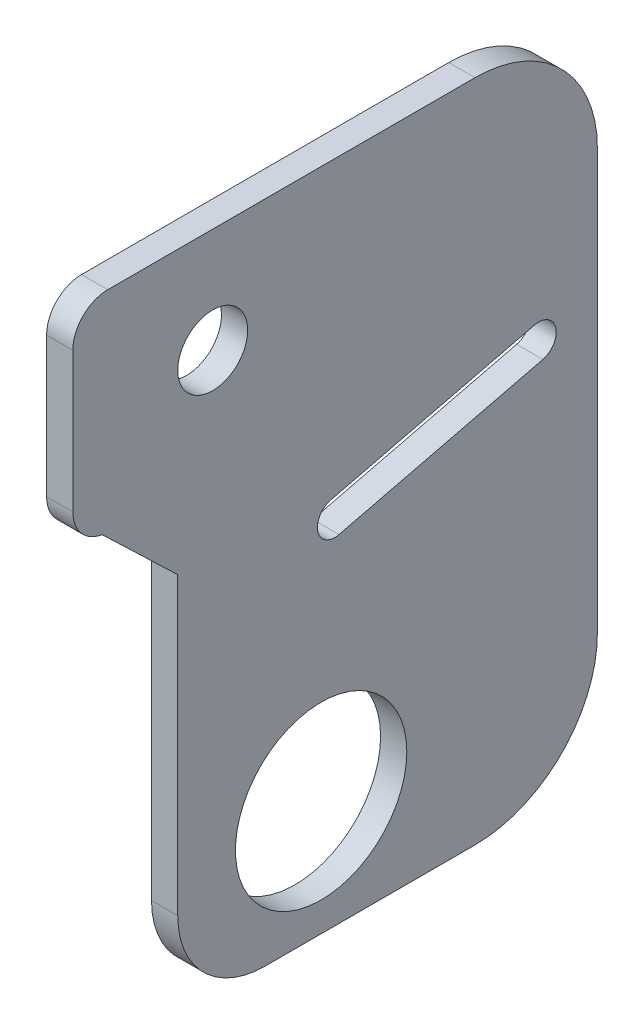
ISO-10303-21;
HEADER;
FILE_DESCRIPTION(('STEP AP214'),'2;1');
FILE_NAME('part.step','',(''),(''),'','','');
FILE_SCHEMA(('AUTOMOTIVE_DESIGN { 1 0 10303 214 1 1 1 1 }'));
ENDSEC;
DATA;
#1=APPLICATION_CONTEXT('core data for automotive mechanical design processes');
#2=APPLICATION_PROTOCOL_DEFINITION('international standard','automotive_design',2000,#1);
#3=PRODUCT_CONTEXT('',#1,'mechanical');
#4=PRODUCT('Part','Part','',(#3));
#5=PRODUCT_RELATED_PRODUCT_CATEGORY('part','',(#4));
#6=PRODUCT_DEFINITION_FORMATION('','',#4);
#7=PRODUCT_DEFINITION_CONTEXT('part definition',#1,'design');
#8=PRODUCT_DEFINITION('design','',#6,#7);
#9=PRODUCT_DEFINITION_SHAPE('','',#8);
#10=(LENGTH_UNIT() NAMED_UNIT(*) SI_UNIT(.MILLI.,.METRE.));
#11=(NAMED_UNIT(*) PLANE_ANGLE_UNIT() SI_UNIT($,.RADIAN.));
#12=(NAMED_UNIT(*) SI_UNIT($,.STERADIAN.) SOLID_ANGLE_UNIT());
#13=UNCERTAINTY_MEASURE_WITH_UNIT(LENGTH_MEASURE(1.E-05),#10,'distance_accuracy_value','');
#14=(GEOMETRIC_REPRESENTATION_CONTEXT(3) GLOBAL_UNCERTAINTY_ASSIGNED_CONTEXT((#13)) GLOBAL_UNIT_ASSIGNED_CONTEXT((#10,
#11,#12)) REPRESENTATION_CONTEXT('',''));
#15=CARTESIAN_POINT('',(0.,0.,0.));
#16=DIRECTION('',(0.,0.,1.));
#17=DIRECTION('',(1.,0.,0.));
#18=AXIS2_PLACEMENT_3D('',#15,#16,#17);
#19=CARTESIAN_POINT('',(7.5,60.,190.));
#20=DIRECTION('',(0.,-1.,0.));
#21=DIRECTION('',(0.,0.,-1.));
#22=AXIS2_PLACEMENT_3D('',#19,#20,#21);
#23=PLANE('',#22);
#24=DIRECTION('',(0.,0.,1.));
#25=VECTOR('',#24,1.);
#26=CARTESIAN_POINT('',(7.5,60.,190.));
#27=LINE('',#26,#25);
#28=CARTESIAN_POINT('',(7.5,60.,-40.));
#29=VERTEX_POINT('',#28);
#30=CARTESIAN_POINT('',(7.5,60.,170.));
#31=VERTEX_POINT('',#30);
#32=EDGE_CURVE('E200',#29,#31,#27,.T.);
#33=ORIENTED_EDGE('',*,*,#32,.F.);
#34=DIRECTION('',(1.,0.,0.));
#35=VECTOR('',#34,1.);
#36=CARTESIAN_POINT('',(7.5,60.,-40.));
#37=LINE('',#36,#35);
#38=CARTESIAN_POINT('',(-7.5,60.,-40.));
#39=VERTEX_POINT('',#38);
#40=EDGE_CURVE('E261',#29,#39,#37,.F.);
#41=ORIENTED_EDGE('',*,*,#40,.T.);
#42=DIRECTION('',(0.,0.,1.));
#43=VECTOR('',#42,1.);
#44=CARTESIAN_POINT('',(-7.5,60.,190.));
#45=LINE('',#44,#43);
#46=CARTESIAN_POINT('',(-7.5,60.,170.));
#47=VERTEX_POINT('',#46);
#48=EDGE_CURVE('E196',#39,#47,#45,.T.);
#49=ORIENTED_EDGE('',*,*,#48,.T.);
#50=DIRECTION('',(-1.,0.,0.));
#51=VECTOR('',#50,1.);
#52=CARTESIAN_POINT('',(7.5,60.,170.));
#53=LINE('',#52,#51);
#54=EDGE_CURVE('E230',#47,#31,#53,.F.);
#55=ORIENTED_EDGE('',*,*,#54,.T.);
#56=EDGE_LOOP('',(#33,#41,#49,#55));
#57=FACE_BOUND('',#56,.T.);
#58=ADVANCED_FACE('F17',(#57),#23,.F.);
#59=CARTESIAN_POINT('',(7.5,60.,190.));
#60=DIRECTION('',(0.,0.,-1.));
#61=DIRECTION('',(0.,1.,0.));
#62=AXIS2_PLACEMENT_3D('',#59,#60,#61);
#63=PLANE('',#62);
#64=DIRECTION('',(0.,-1.,0.));
#65=VECTOR('',#64,1.);
#66=CARTESIAN_POINT('',(-7.5,60.,190.));
#67=LINE('',#66,#65);
#68=CARTESIAN_POINT('',(-7.5,40.,190.));
#69=VERTEX_POINT('',#68);
#70=CARTESIAN_POINT('',(-7.5,-40.,190.));
#71=VERTEX_POINT('',#70);
#72=EDGE_CURVE('E204',#69,#71,#67,.T.);
#73=ORIENTED_EDGE('',*,*,#72,.T.);
#74=DIRECTION('',(-1.,0.,0.));
#75=VECTOR('',#74,1.);
#76=CARTESIAN_POINT('',(7.5,-40.,190.));
#77=LINE('',#76,#75);
#78=CARTESIAN_POINT('',(7.5,-40.,190.));
#79=VERTEX_POINT('',#78);
#80=EDGE_CURVE('E222',#71,#79,#77,.F.);
#81=ORIENTED_EDGE('',*,*,#80,.T.);
#82=DIRECTION('',(0.,-1.,0.));
#83=VECTOR('',#82,1.);
#84=CARTESIAN_POINT('',(7.5,60.,190.));
#85=LINE('',#84,#83);
#86=CARTESIAN_POINT('',(7.5,40.,190.));
#87=VERTEX_POINT('',#86);
#88=EDGE_CURVE('E203',#87,#79,#85,.T.);
#89=ORIENTED_EDGE('',*,*,#88,.F.);
#90=DIRECTION('',(-1.,0.,0.));
#91=VECTOR('',#90,1.);
#92=CARTESIAN_POINT('',(7.5,40.,190.));
#93=LINE('',#92,#91);
#94=EDGE_CURVE('E219',#87,#69,#93,.T.);
#95=ORIENTED_EDGE('',*,*,#94,.T.);
#96=EDGE_LOOP('',(#73,#81,#89,#95));
#97=FACE_BOUND('',#96,.T.);
#98=ADVANCED_FACE('F288',(#97),#63,.F.);
#99=CARTESIAN_POINT('',(7.5,0.,0.));
#100=DIRECTION('',(1.,0.,0.));
#101=DIRECTION('',(0.,0.,-1.));
#102=AXIS2_PLACEMENT_3D('',#99,#100,#101);
#103=PLANE('',#102);
#104=DIRECTION('',(0.,-1.,0.));
#105=VECTOR('',#104,1.);
#106=CARTESIAN_POINT('',(7.5,-320.,130.));
#107=LINE('',#106,#105);
#108=CARTESIAN_POINT('',(7.5,-101.142618033245,130.));
#109=VERTEX_POINT('',#108);
#110=CARTESIAN_POINT('',(7.5,-270.,130.));
#111=VERTEX_POINT('',#110);
#112=EDGE_CURVE('E183',#109,#111,#107,.T.);
#113=ORIENTED_EDGE('',*,*,#112,.T.);
#114=CARTESIAN_POINT('',(7.5,-270.,80.));
#115=DIRECTION('',(1.,0.,0.));
#116=DIRECTION('',(0.,0.,-1.));
#117=AXIS2_PLACEMENT_3D('',#114,#115,#116);
#118=CIRCLE('',#117,50.);
#119=CARTESIAN_POINT('',(7.5,-320.,80.));
#120=VERTEX_POINT('',#119);
#121=EDGE_CURVE('E39',#111,#120,#118,.T.);
#122=ORIENTED_EDGE('',*,*,#121,.T.);
#123=DIRECTION('',(0.,0.,-1.));
#124=VECTOR('',#123,1.);
#125=CARTESIAN_POINT('',(7.5,-320.,-190.));
#126=LINE('',#125,#124);
#127=CARTESIAN_POINT('',(7.5,-320.,-40.));
#128=VERTEX_POINT('',#127);
#129=EDGE_CURVE('E187',#120,#128,#126,.T.);
#130=ORIENTED_EDGE('',*,*,#129,.T.);
#131=CARTESIAN_POINT('',(7.5,-250.,-40.));
#132=DIRECTION('',(1.,0.,0.));
#133=DIRECTION('',(0.,0.,-1.));
#134=AXIS2_PLACEMENT_3D('',#131,#132,#133);
#135=CIRCLE('',#134,70.);
#136=CARTESIAN_POINT('',(7.5,-250.,-110.));
#137=VERTEX_POINT('',#136);
#138=EDGE_CURVE('E250',#128,#137,#135,.T.);
#139=ORIENTED_EDGE('',*,*,#138,.T.);
#140=DIRECTION('',(0.,-1.,0.));
#141=VECTOR('',#140,1.);
#142=CARTESIAN_POINT('',(7.5,60.,-110.));
#143=LINE('',#142,#141);
#144=CARTESIAN_POINT('',(7.5,-10.,-110.));
#145=VERTEX_POINT('',#144);
#146=EDGE_CURVE('E308',#145,#137,#143,.T.);
#147=ORIENTED_EDGE('',*,*,#146,.F.);
#148=CARTESIAN_POINT('',(7.5,-10.,-40.));
#149=DIRECTION('',(1.,0.,0.));
#150=DIRECTION('',(0.,0.,-1.));
#151=AXIS2_PLACEMENT_3D('',#148,#149,#150);
#152=CIRCLE('',#151,70.);
#153=EDGE_CURVE('E248',#145,#29,#152,.T.);
#154=ORIENTED_EDGE('',*,*,#153,.T.);
#155=ORIENTED_EDGE('',*,*,#32,.T.);
#156=CARTESIAN_POINT('',(7.5,40.,170.));
#157=DIRECTION('',(1.,0.,0.));
#158=DIRECTION('',(0.,0.,-1.));
#159=AXIS2_PLACEMENT_3D('',#156,#157,#158);
#160=CIRCLE('',#159,20.);
#161=EDGE_CURVE('E224',#31,#87,#160,.T.);
#162=ORIENTED_EDGE('',*,*,#161,.T.);
#163=ORIENTED_EDGE('',*,*,#88,.T.);
#164=CARTESIAN_POINT('',(7.5,-40.,170.));
#165=DIRECTION('',(1.,0.,0.));
#166=DIRECTION('',(0.,0.,-1.));
#167=AXIS2_PLACEMENT_3D('',#164,#165,#166);
#168=CIRCLE('',#167,20.);
#169=CARTESIAN_POINT('',(7.5,-59.7377568340172,173.228150424191));
#170=VERTEX_POINT('',#169);
#171=EDGE_CURVE('E227',#79,#170,#168,.T.);
#172=ORIENTED_EDGE('',*,*,#171,.T.);
#173=DIRECTION('',(0.,0.691712742762419,0.722172750455243));
#174=VECTOR('',#173,1.);
#175=CARTESIAN_POINT('',(7.5,-59.7377568340172,173.228150424191));
#176=LINE('',#175,#174);
#177=EDGE_CURVE('E240',#170,#109,#176,.F.);
#178=ORIENTED_EDGE('',*,*,#177,.T.);
#179=EDGE_LOOP('',(#113,#122,#130,#139,#147,#154,#155,#162,#163,#172,#178));
#180=FACE_BOUND('',#179,.T.);
#181=CARTESIAN_POINT('',(7.5,-117.661235254384,40.1385534607934));
#182=DIRECTION('',(1.,0.,0.));
#183=DIRECTION('',(0.,0.,-1.));
#184=AXIS2_PLACEMENT_3D('',#181,#182,#183);
#185=CIRCLE('',#184,10.);
#186=CARTESIAN_POINT('',(7.5,-107.945873619582,42.507466355989));
#187=VERTEX_POINT('',#186);
#188=CARTESIAN_POINT('',(7.5,-127.376596889186,37.7696405655978));
#189=VERTEX_POINT('',#188);
#190=EDGE_CURVE('E130',#187,#189,#185,.T.);
#191=ORIENTED_EDGE('',*,*,#190,.F.);
#192=DIRECTION('',(0.,-0.236891289519562,0.971536163480166));
#193=VECTOR('',#192,1.);
#194=CARTESIAN_POINT('',(7.5,-107.945873619582,42.507466355989));
#195=LINE('',#194,#193);
#196=CARTESIAN_POINT('',(7.5,-79.518918877235,-74.0768732616309));
#197=VERTEX_POINT('',#196);
#198=EDGE_CURVE('E136',#197,#187,#195,.T.);
#199=ORIENTED_EDGE('',*,*,#198,.F.);
#200=CARTESIAN_POINT('',(7.5,-89.2342805120367,-76.4457861568265));
#201=DIRECTION('',(1.,0.,0.));
#202=DIRECTION('',(0.,0.,-1.));
#203=AXIS2_PLACEMENT_3D('',#200,#201,#202);
#204=CIRCLE('',#203,10.);
#205=CARTESIAN_POINT('',(7.5,-98.9496421468384,-78.8146990520221));
#206=VERTEX_POINT('',#205);
#207=EDGE_CURVE('E167',#206,#197,#204,.T.);
#208=ORIENTED_EDGE('',*,*,#207,.F.);
#209=DIRECTION('',(0.,0.236891289519562,-0.971536163480166));
#210=VECTOR('',#209,1.);
#211=CARTESIAN_POINT('',(7.5,-127.376596889186,37.7696405655977));
#212=LINE('',#211,#210);
#213=EDGE_CURVE('E158',#189,#206,#212,.T.);
#214=ORIENTED_EDGE('',*,*,#213,.F.);
#215=EDGE_LOOP('',(#191,#199,#208,#214));
#216=FACE_BOUND('',#215,.T.);
#217=CARTESIAN_POINT('',(7.5,-254.273773670333,48.));
#218=DIRECTION('',(1.,0.,0.));
#219=DIRECTION('',(0.,0.,-1.));
#220=AXIS2_PLACEMENT_3D('',#217,#218,#219);
#221=CIRCLE('',#220,49.);
#222=CARTESIAN_POINT('',(7.5,-254.273773670333,-1.));
#223=VERTEX_POINT('',#222);
#224=EDGE_CURVE('E144',#223,#223,#221,.T.);
#225=ORIENTED_EDGE('',*,*,#224,.F.);
#226=EDGE_LOOP('',(#225));
#227=FACE_BOUND('',#226,.T.);
#228=CARTESIAN_POINT('',(7.5,0.,110.));
#229=DIRECTION('',(1.,0.,0.));
#230=DIRECTION('',(0.,0.,-1.));
#231=AXIS2_PLACEMENT_3D('',#228,#229,#230);
#232=CIRCLE('',#231,20.);
#233=CARTESIAN_POINT('',(7.5,0.,90.));
#234=VERTEX_POINT('',#233);
#235=EDGE_CURVE('E191',#234,#234,#232,.T.);
#236=ORIENTED_EDGE('',*,*,#235,.F.);
#237=EDGE_LOOP('',(#236));
#238=FACE_BOUND('',#237,.T.);
#239=ADVANCED_FACE('F274',(#180,#216,#227,#238),#103,.T.);
#240=CARTESIAN_POINT('',(-7.5,0.,0.));
#241=DIRECTION('',(1.,0.,0.));
#242=DIRECTION('',(0.,0.,-1.));
#243=AXIS2_PLACEMENT_3D('',#240,#241,#242);
#244=PLANE('',#243);
#245=DIRECTION('',(0.,0.236891289519562,-0.971536163480166));
#246=VECTOR('',#245,1.);
#247=CARTESIAN_POINT('',(-7.5,-107.945873619582,42.507466355989));
#248=LINE('',#247,#246);
#249=CARTESIAN_POINT('',(-7.5,-107.945873619582,42.507466355989));
#250=VERTEX_POINT('',#249);
#251=CARTESIAN_POINT('',(-7.5,-79.518918877235,-74.0768732616309));
#252=VERTEX_POINT('',#251);
#253=EDGE_CURVE('E150',#250,#252,#248,.T.);
#254=ORIENTED_EDGE('',*,*,#253,.F.);
#255=CARTESIAN_POINT('',(-7.5,-117.661235254384,40.1385534607934));
#256=DIRECTION('',(1.,0.,0.));
#257=DIRECTION('',(0.,0.,-1.));
#258=AXIS2_PLACEMENT_3D('',#255,#256,#257);
#259=CIRCLE('',#258,10.);
#260=CARTESIAN_POINT('',(-7.5,-127.376596889186,37.7696405655977));
#261=VERTEX_POINT('',#260);
#262=EDGE_CURVE('E127',#261,#250,#259,.F.);
#263=ORIENTED_EDGE('',*,*,#262,.F.);
#264=DIRECTION('',(0.,-0.236891289519562,0.971536163480166));
#265=VECTOR('',#264,1.);
#266=CARTESIAN_POINT('',(-7.5,-127.376596889186,37.7696405655977));
#267=LINE('',#266,#265);
#268=CARTESIAN_POINT('',(-7.5,-98.9496421468384,-78.8146990520221));
#269=VERTEX_POINT('',#268);
#270=EDGE_CURVE('E140',#269,#261,#267,.T.);
#271=ORIENTED_EDGE('',*,*,#270,.F.);
#272=CARTESIAN_POINT('',(-7.5,-89.2342805120367,-76.4457861568265));
#273=DIRECTION('',(1.,0.,0.));
#274=DIRECTION('',(0.,0.,-1.));
#275=AXIS2_PLACEMENT_3D('',#272,#273,#274);
#276=CIRCLE('',#275,10.);
#277=EDGE_CURVE('E161',#252,#269,#276,.F.);
#278=ORIENTED_EDGE('',*,*,#277,.F.);
#279=EDGE_LOOP('',(#254,#263,#271,#278));
#280=FACE_BOUND('',#279,.T.);
#281=CARTESIAN_POINT('',(-7.5,-254.273773670333,48.));
#282=DIRECTION('',(1.,0.,0.));
#283=DIRECTION('',(0.,0.,-1.));
#284=AXIS2_PLACEMENT_3D('',#281,#282,#283);
#285=CIRCLE('',#284,49.);
#286=CARTESIAN_POINT('',(-7.5,-254.273773670333,-1.));
#287=VERTEX_POINT('',#286);
#288=EDGE_CURVE('E180',#287,#287,#285,.F.);
#289=ORIENTED_EDGE('',*,*,#288,.F.);
#290=EDGE_LOOP('',(#289));
#291=FACE_BOUND('',#290,.T.);
#292=CARTESIAN_POINT('',(-7.5,0.,110.));
#293=DIRECTION('',(1.,0.,0.));
#294=DIRECTION('',(0.,0.,-1.));
#295=AXIS2_PLACEMENT_3D('',#292,#293,#294);
#296=CIRCLE('',#295,20.);
#297=CARTESIAN_POINT('',(-7.5,0.,90.));
#298=VERTEX_POINT('',#297);
#299=EDGE_CURVE('E192',#298,#298,#296,.T.);
#300=ORIENTED_EDGE('',*,*,#299,.T.);
#301=EDGE_LOOP('',(#300));
#302=FACE_BOUND('',#301,.T.);
#303=DIRECTION('',(0.,0.,1.));
#304=VECTOR('',#303,1.);
#305=CARTESIAN_POINT('',(-7.5,-320.,-190.));
#306=LINE('',#305,#304);
#307=CARTESIAN_POINT('',(-7.5,-320.,-40.));
#308=VERTEX_POINT('',#307);
#309=CARTESIAN_POINT('',(-7.5,-320.,80.));
#310=VERTEX_POINT('',#309);
#311=EDGE_CURVE('E186',#308,#310,#306,.T.);
#312=ORIENTED_EDGE('',*,*,#311,.T.);
#313=CARTESIAN_POINT('',(-7.5,-270.,80.));
#314=DIRECTION('',(1.,0.,0.));
#315=DIRECTION('',(0.,0.,-1.));
#316=AXIS2_PLACEMENT_3D('',#313,#314,#315);
#317=CIRCLE('',#316,50.);
#318=CARTESIAN_POINT('',(-7.5,-270.,130.));
#319=VERTEX_POINT('',#318);
#320=EDGE_CURVE('E11',#310,#319,#317,.F.);
#321=ORIENTED_EDGE('',*,*,#320,.T.);
#322=DIRECTION('',(0.,1.,0.));
#323=VECTOR('',#322,1.);
#324=CARTESIAN_POINT('',(-7.5,-320.,130.));
#325=LINE('',#324,#323);
#326=CARTESIAN_POINT('',(-7.5,-101.142618033245,130.));
#327=VERTEX_POINT('',#326);
#328=EDGE_CURVE('E184',#319,#327,#325,.T.);
#329=ORIENTED_EDGE('',*,*,#328,.T.);
#330=DIRECTION('',(0.,-0.691712742762419,-0.722172750455243));
#331=VECTOR('',#330,1.);
#332=CARTESIAN_POINT('',(-7.5,-117.68895392645,112.725035750778));
#333=LINE('',#332,#331);
#334=CARTESIAN_POINT('',(-7.5,-59.7377568340172,173.228150424191));
#335=VERTEX_POINT('',#334);
#336=EDGE_CURVE('E242',#327,#335,#333,.F.);
#337=ORIENTED_EDGE('',*,*,#336,.T.);
#338=CARTESIAN_POINT('',(-7.5,-40.,170.));
#339=DIRECTION('',(1.,0.,0.));
#340=DIRECTION('',(0.,0.,-1.));
#341=AXIS2_PLACEMENT_3D('',#338,#339,#340);
#342=CIRCLE('',#341,20.);
#343=EDGE_CURVE('E217',#335,#71,#342,.F.);
#344=ORIENTED_EDGE('',*,*,#343,.T.);
#345=ORIENTED_EDGE('',*,*,#72,.F.);
#346=CARTESIAN_POINT('',(-7.5,40.,170.));
#347=DIRECTION('',(1.,0.,0.));
#348=DIRECTION('',(0.,0.,-1.));
#349=AXIS2_PLACEMENT_3D('',#346,#347,#348);
#350=CIRCLE('',#349,20.);
#351=EDGE_CURVE('E208',#69,#47,#350,.F.);
#352=ORIENTED_EDGE('',*,*,#351,.T.);
#353=ORIENTED_EDGE('',*,*,#48,.F.);
#354=CARTESIAN_POINT('',(-7.5,-10.,-40.));
#355=DIRECTION('',(1.,0.,0.));
#356=DIRECTION('',(0.,0.,-1.));
#357=AXIS2_PLACEMENT_3D('',#354,#355,#356);
#358=CIRCLE('',#357,70.);
#359=CARTESIAN_POINT('',(-7.5,-10.,-110.));
#360=VERTEX_POINT('',#359);
#361=EDGE_CURVE('E257',#39,#360,#358,.F.);
#362=ORIENTED_EDGE('',*,*,#361,.T.);
#363=DIRECTION('',(0.,1.,0.));
#364=VECTOR('',#363,1.);
#365=CARTESIAN_POINT('',(-7.5,60.,-110.));
#366=LINE('',#365,#364);
#367=CARTESIAN_POINT('',(-7.5,-250.,-110.));
#368=VERTEX_POINT('',#367);
#369=EDGE_CURVE('E310',#368,#360,#366,.T.);
#370=ORIENTED_EDGE('',*,*,#369,.F.);
#371=CARTESIAN_POINT('',(-7.5,-250.,-40.));
#372=DIRECTION('',(1.,0.,0.));
#373=DIRECTION('',(0.,0.,-1.));
#374=AXIS2_PLACEMENT_3D('',#371,#372,#373);
#375=CIRCLE('',#374,70.);
#376=EDGE_CURVE('E259',#368,#308,#375,.F.);
#377=ORIENTED_EDGE('',*,*,#376,.T.);
#378=EDGE_LOOP('',(#312,#321,#329,#337,#344,#345,#352,#353,#362,#370,#377));
#379=FACE_BOUND('',#378,.T.);
#380=ADVANCED_FACE('F147',(#280,#291,#302,#379),#244,.F.);
#381=CARTESIAN_POINT('',(-7.5,0.,110.));
#382=DIRECTION('',(1.,0.,0.));
#383=DIRECTION('',(0.,0.,-1.));
#384=AXIS2_PLACEMENT_3D('',#381,#382,#383);
#385=CYLINDRICAL_SURFACE('',#384,20.);
#386=ORIENTED_EDGE('',*,*,#299,.F.);
#387=EDGE_LOOP('',(#386));
#388=FACE_BOUND('',#387,.T.);
#389=ORIENTED_EDGE('',*,*,#235,.T.);
#390=EDGE_LOOP('',(#389));
#391=FACE_BOUND('',#390,.T.);
#392=ADVANCED_FACE('F332',(#388,#391),#385,.F.);
#393=CARTESIAN_POINT('',(7.5,-40.,170.));
#394=DIRECTION('',(-1.,0.,0.));
#395=DIRECTION('',(0.,0.,1.));
#396=AXIS2_PLACEMENT_3D('',#393,#394,#395);
#397=CYLINDRICAL_SURFACE('',#396,20.);
#398=ORIENTED_EDGE('',*,*,#343,.F.);
#399=DIRECTION('',(-1.,0.,0.));
#400=VECTOR('',#399,1.);
#401=CARTESIAN_POINT('',(7.5,-59.7377568340172,173.228150424191));
#402=LINE('',#401,#400);
#403=EDGE_CURVE('E234',#335,#170,#402,.F.);
#404=ORIENTED_EDGE('',*,*,#403,.T.);
#405=ORIENTED_EDGE('',*,*,#171,.F.);
#406=ORIENTED_EDGE('',*,*,#80,.F.);
#407=EDGE_LOOP('',(#398,#404,#405,#406));
#408=FACE_BOUND('',#407,.T.);
#409=ADVANCED_FACE('F283',(#408),#397,.T.);
#410=CARTESIAN_POINT('',(7.5,40.,170.));
#411=DIRECTION('',(-1.,0.,0.));
#412=DIRECTION('',(0.,0.,1.));
#413=AXIS2_PLACEMENT_3D('',#410,#411,#412);
#414=CYLINDRICAL_SURFACE('',#413,20.);
#415=ORIENTED_EDGE('',*,*,#161,.F.);
#416=ORIENTED_EDGE('',*,*,#54,.F.);
#417=ORIENTED_EDGE('',*,*,#351,.F.);
#418=ORIENTED_EDGE('',*,*,#94,.F.);
#419=EDGE_LOOP('',(#415,#416,#417,#418));
#420=FACE_BOUND('',#419,.T.);
#421=ADVANCED_FACE('F293',(#420),#414,.T.);
#422=CARTESIAN_POINT('',(-419.810562561766,-320.,130.));
#423=DIRECTION('',(0.,0.,1.));
#424=DIRECTION('',(1.,0.,0.));
#425=AXIS2_PLACEMENT_3D('',#422,#423,#424);
#426=PLANE('',#425);
#427=ORIENTED_EDGE('',*,*,#328,.F.);
#428=DIRECTION('',(1.,0.,0.));
#429=VECTOR('',#428,1.);
#430=CARTESIAN_POINT('',(-419.810562561766,-270.,130.));
#431=LINE('',#430,#429);
#432=EDGE_CURVE('E263',#319,#111,#431,.T.);
#433=ORIENTED_EDGE('',*,*,#432,.T.);
#434=ORIENTED_EDGE('',*,*,#112,.F.);
#435=DIRECTION('',(-1.,0.,0.));
#436=VECTOR('',#435,1.);
#437=CARTESIAN_POINT('',(-7.5,-101.142618033245,130.));
#438=LINE('',#437,#436);
#439=EDGE_CURVE('E237',#109,#327,#438,.T.);
#440=ORIENTED_EDGE('',*,*,#439,.T.);
#441=EDGE_LOOP('',(#427,#433,#434,#440));
#442=FACE_BOUND('',#441,.T.);
#443=ADVANCED_FACE('F270',(#442),#426,.T.);
#444=CARTESIAN_POINT('',(-419.810562561766,-320.,-190.));
#445=DIRECTION('',(0.,-1.,0.));
#446=DIRECTION('',(0.,0.,-1.));
#447=AXIS2_PLACEMENT_3D('',#444,#445,#446);
#448=PLANE('',#447);
#449=ORIENTED_EDGE('',*,*,#129,.F.);
#450=DIRECTION('',(1.,0.,0.));
#451=VECTOR('',#450,1.);
#452=CARTESIAN_POINT('',(-419.810562561766,-320.,80.));
#453=LINE('',#452,#451);
#454=EDGE_CURVE('E25',#120,#310,#453,.F.);
#455=ORIENTED_EDGE('',*,*,#454,.T.);
#456=ORIENTED_EDGE('',*,*,#311,.F.);
#457=DIRECTION('',(1.,0.,0.));
#458=VECTOR('',#457,1.);
#459=CARTESIAN_POINT('',(7.5,-320.,-40.));
#460=LINE('',#459,#458);
#461=EDGE_CURVE('E245',#308,#128,#460,.T.);
#462=ORIENTED_EDGE('',*,*,#461,.T.);
#463=EDGE_LOOP('',(#449,#455,#456,#462));
#464=FACE_BOUND('',#463,.T.);
#465=ADVANCED_FACE('F359',(#464),#448,.T.);
#466=CARTESIAN_POINT('',(7.5,-59.7377568340172,173.228150424191));
#467=DIRECTION('',(0.,-0.722172750455243,0.691712742762419));
#468=DIRECTION('',(-1.,0.,0.));
#469=AXIS2_PLACEMENT_3D('',#466,#467,#468);
#470=PLANE('',#469);
#471=ORIENTED_EDGE('',*,*,#336,.F.);
#472=ORIENTED_EDGE('',*,*,#439,.F.);
#473=ORIENTED_EDGE('',*,*,#177,.F.);
#474=ORIENTED_EDGE('',*,*,#403,.F.);
#475=EDGE_LOOP('',(#471,#472,#473,#474));
#476=FACE_BOUND('',#475,.T.);
#477=ADVANCED_FACE('F280',(#476),#470,.T.);
#478=CARTESIAN_POINT('',(-7.50100000000012,-254.273773670333,48.));
#479=DIRECTION('',(1.,0.,0.));
#480=DIRECTION('',(0.,0.,-1.));
#481=AXIS2_PLACEMENT_3D('',#478,#479,#480);
#482=CYLINDRICAL_SURFACE('',#481,49.);
#483=ORIENTED_EDGE('',*,*,#224,.T.);
#484=EDGE_LOOP('',(#483));
#485=FACE_BOUND('',#484,.T.);
#486=ORIENTED_EDGE('',*,*,#288,.T.);
#487=EDGE_LOOP('',(#486));
#488=FACE_BOUND('',#487,.T.);
#489=ADVANCED_FACE('F358',(#485,#488),#482,.F.);
#490=CARTESIAN_POINT('',(-7.50100000000012,-117.661235254384,40.1385534607934));
#491=DIRECTION('',(1.,0.,0.));
#492=DIRECTION('',(0.,0.,-1.));
#493=AXIS2_PLACEMENT_3D('',#490,#491,#492);
#494=CYLINDRICAL_SURFACE('',#493,10.);
#495=ORIENTED_EDGE('',*,*,#262,.T.);
#496=DIRECTION('',(1.,0.,0.));
#497=VECTOR('',#496,1.);
#498=CARTESIAN_POINT('',(-7.50100000000012,-107.945873619582,42.507466355989));
#499=LINE('',#498,#497);
#500=EDGE_CURVE('E145',#250,#187,#499,.T.);
#501=ORIENTED_EDGE('',*,*,#500,.T.);
#502=ORIENTED_EDGE('',*,*,#190,.T.);
#503=DIRECTION('',(1.,0.,0.));
#504=VECTOR('',#503,1.);
#505=CARTESIAN_POINT('',(-7.50100000000012,-127.376596889186,37.7696405655977));
#506=LINE('',#505,#504);
#507=EDGE_CURVE('E123',#261,#189,#506,.T.);
#508=ORIENTED_EDGE('',*,*,#507,.F.);
#509=EDGE_LOOP('',(#495,#501,#502,#508));
#510=FACE_BOUND('',#509,.T.);
#511=ADVANCED_FACE('F125',(#510),#494,.F.);
#512=CARTESIAN_POINT('',(-7.50100000000012,-107.945873619582,42.507466355989));
#513=DIRECTION('',(0.,0.971536163480166,0.236891289519562));
#514=DIRECTION('',(0.,-0.236891289519562,0.971536163480166));
#515=AXIS2_PLACEMENT_3D('',#512,#513,#514);
#516=PLANE('',#515);
#517=ORIENTED_EDGE('',*,*,#253,.T.);
#518=DIRECTION('',(1.,0.,0.));
#519=VECTOR('',#518,1.);
#520=CARTESIAN_POINT('',(-7.50100000000012,-79.518918877235,-74.0768732616309));
#521=LINE('',#520,#519);
#522=EDGE_CURVE('E174',#252,#197,#521,.T.);
#523=ORIENTED_EDGE('',*,*,#522,.T.);
#524=ORIENTED_EDGE('',*,*,#198,.T.);
#525=ORIENTED_EDGE('',*,*,#500,.F.);
#526=EDGE_LOOP('',(#517,#523,#524,#525));
#527=FACE_BOUND('',#526,.T.);
#528=ADVANCED_FACE('F324',(#527),#516,.F.);
#529=CARTESIAN_POINT('',(-7.50100000000012,-89.2342805120367,-76.4457861568265));
#530=DIRECTION('',(1.,0.,0.));
#531=DIRECTION('',(0.,0.,-1.));
#532=AXIS2_PLACEMENT_3D('',#529,#530,#531);
#533=CYLINDRICAL_SURFACE('',#532,10.);
#534=ORIENTED_EDGE('',*,*,#277,.T.);
#535=DIRECTION('',(1.,0.,0.));
#536=VECTOR('',#535,1.);
#537=CARTESIAN_POINT('',(-7.50100000000012,-98.9496421468384,-78.8146990520221));
#538=LINE('',#537,#536);
#539=EDGE_CURVE('E135',#269,#206,#538,.T.);
#540=ORIENTED_EDGE('',*,*,#539,.T.);
#541=ORIENTED_EDGE('',*,*,#207,.T.);
#542=ORIENTED_EDGE('',*,*,#522,.F.);
#543=EDGE_LOOP('',(#534,#540,#541,#542));
#544=FACE_BOUND('',#543,.T.);
#545=ADVANCED_FACE('F320',(#544),#533,.F.);
#546=CARTESIAN_POINT('',(-7.50100000000012,-127.376596889186,37.7696405655977));
#547=DIRECTION('',(0.,-0.971536163480166,-0.236891289519562));
#548=DIRECTION('',(0.,0.236891289519562,-0.971536163480166));
#549=AXIS2_PLACEMENT_3D('',#546,#547,#548);
#550=PLANE('',#549);
#551=ORIENTED_EDGE('',*,*,#270,.T.);
#552=ORIENTED_EDGE('',*,*,#507,.T.);
#553=ORIENTED_EDGE('',*,*,#213,.T.);
#554=ORIENTED_EDGE('',*,*,#539,.F.);
#555=EDGE_LOOP('',(#551,#552,#553,#554));
#556=FACE_BOUND('',#555,.T.);
#557=ADVANCED_FACE('F141',(#556),#550,.F.);
#558=CARTESIAN_POINT('',(-7.50100000000012,60.,-110.));
#559=DIRECTION('',(0.,0.,1.));
#560=DIRECTION('',(0.,-1.,0.));
#561=AXIS2_PLACEMENT_3D('',#558,#559,#560);
#562=PLANE('',#561);
#563=ORIENTED_EDGE('',*,*,#146,.T.);
#564=DIRECTION('',(1.,0.,0.));
#565=VECTOR('',#564,1.);
#566=CARTESIAN_POINT('',(-7.50000000000012,-250.,-110.));
#567=LINE('',#566,#565);
#568=EDGE_CURVE('E255',#137,#368,#567,.F.);
#569=ORIENTED_EDGE('',*,*,#568,.T.);
#570=ORIENTED_EDGE('',*,*,#369,.T.);
#571=DIRECTION('',(1.,0.,0.));
#572=VECTOR('',#571,1.);
#573=CARTESIAN_POINT('',(-7.50100000000012,-10.,-110.));
#574=LINE('',#573,#572);
#575=EDGE_CURVE('E252',#360,#145,#574,.T.);
#576=ORIENTED_EDGE('',*,*,#575,.T.);
#577=EDGE_LOOP('',(#563,#569,#570,#576));
#578=FACE_BOUND('',#577,.T.);
#579=ADVANCED_FACE('F307',(#578),#562,.F.);
#580=CARTESIAN_POINT('',(-419.810562561766,-250.,-40.));
#581=DIRECTION('',(-1.,0.,0.));
#582=DIRECTION('',(0.,0.,1.));
#583=AXIS2_PLACEMENT_3D('',#580,#581,#582);
#584=CYLINDRICAL_SURFACE('',#583,70.);
#585=ORIENTED_EDGE('',*,*,#376,.F.);
#586=ORIENTED_EDGE('',*,*,#568,.F.);
#587=ORIENTED_EDGE('',*,*,#138,.F.);
#588=ORIENTED_EDGE('',*,*,#461,.F.);
#589=EDGE_LOOP('',(#585,#586,#587,#588));
#590=FACE_BOUND('',#589,.T.);
#591=ADVANCED_FACE('F360',(#590),#584,.T.);
#592=CARTESIAN_POINT('',(-7.50100000000012,-10.,-40.));
#593=DIRECTION('',(1.,0.,0.));
#594=DIRECTION('',(0.,0.,-1.));
#595=AXIS2_PLACEMENT_3D('',#592,#593,#594);
#596=CYLINDRICAL_SURFACE('',#595,70.);
#597=ORIENTED_EDGE('',*,*,#361,.F.);
#598=ORIENTED_EDGE('',*,*,#40,.F.);
#599=ORIENTED_EDGE('',*,*,#153,.F.);
#600=ORIENTED_EDGE('',*,*,#575,.F.);
#601=EDGE_LOOP('',(#597,#598,#599,#600));
#602=FACE_BOUND('',#601,.T.);
#603=ADVANCED_FACE('F303',(#602),#596,.T.);
#604=CARTESIAN_POINT('',(-419.810562561766,-270.,80.));
#605=DIRECTION('',(1.,0.,0.));
#606=DIRECTION('',(0.,0.,-1.));
#607=AXIS2_PLACEMENT_3D('',#604,#605,#606);
#608=CYLINDRICAL_SURFACE('',#607,50.);
#609=ORIENTED_EDGE('',*,*,#320,.F.);
#610=ORIENTED_EDGE('',*,*,#454,.F.);
#611=ORIENTED_EDGE('',*,*,#121,.F.);
#612=ORIENTED_EDGE('',*,*,#432,.F.);
#613=EDGE_LOOP('',(#609,#610,#611,#612));
#614=FACE_BOUND('',#613,.T.);
#615=ADVANCED_FACE('F19',(#614),#608,.T.);
#616=CLOSED_SHELL('',(#58,#98,#239,#380,#392,#409,#421,#443,#465,#477,#489,#511,#528,#545,#557,
#579,#591,#603,#615));
#617=MANIFOLD_SOLID_BREP('B1',#616);
#618=ADVANCED_BREP_SHAPE_REPRESENTATION('',(#18,#617),#14);
#619=SHAPE_DEFINITION_REPRESENTATION(#9,#618);
ENDSEC;
END-ISO-10303-21;
